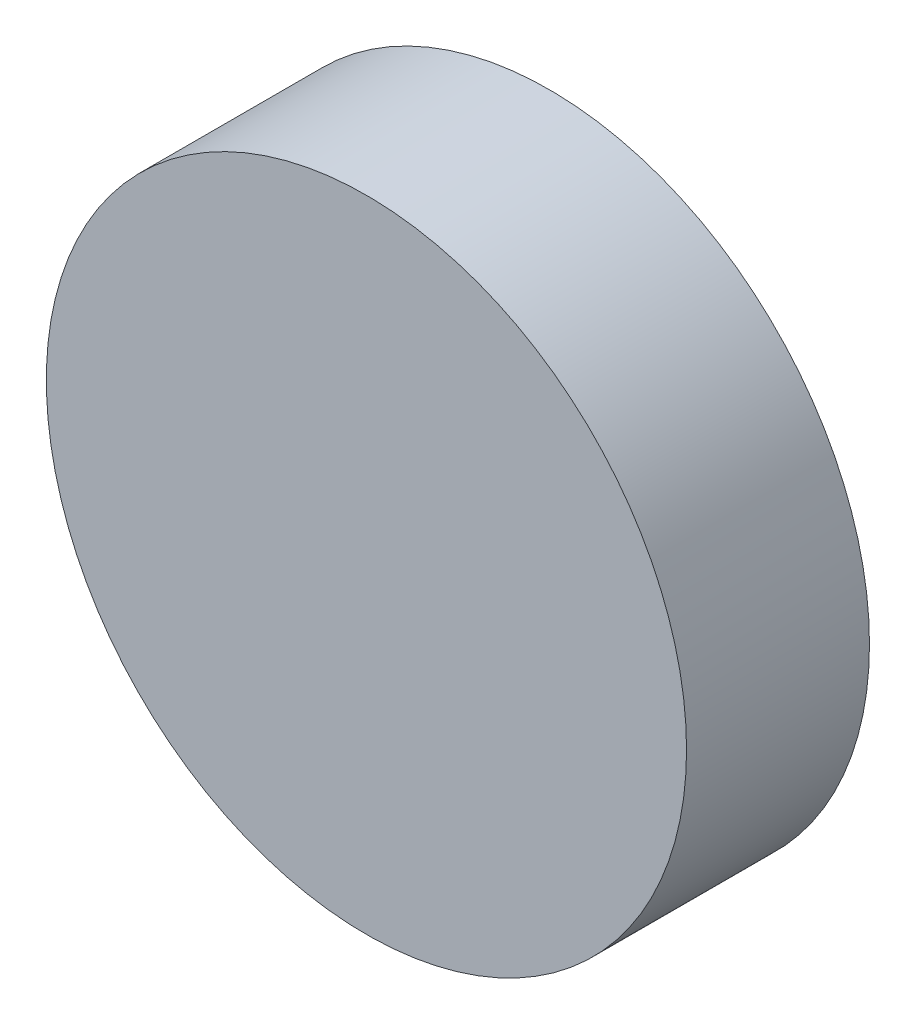
ISO-10303-21;
HEADER;
FILE_DESCRIPTION(('STEP AP214'),'2;1');
FILE_NAME('part.step','',(''),(''),'','','');
FILE_SCHEMA(('AUTOMOTIVE_DESIGN { 1 0 10303 214 1 1 1 1 }'));
ENDSEC;
DATA;
#1=APPLICATION_CONTEXT('core data for automotive mechanical design processes');
#2=APPLICATION_PROTOCOL_DEFINITION('international standard','automotive_design',2000,#1);
#3=PRODUCT_CONTEXT('',#1,'mechanical');
#4=PRODUCT('Part','Part','',(#3));
#5=PRODUCT_RELATED_PRODUCT_CATEGORY('part','',(#4));
#6=PRODUCT_DEFINITION_FORMATION('','',#4);
#7=PRODUCT_DEFINITION_CONTEXT('part definition',#1,'design');
#8=PRODUCT_DEFINITION('design','',#6,#7);
#9=PRODUCT_DEFINITION_SHAPE('','',#8);
#10=(LENGTH_UNIT() NAMED_UNIT(*) SI_UNIT(.MILLI.,.METRE.));
#11=(NAMED_UNIT(*) PLANE_ANGLE_UNIT() SI_UNIT($,.RADIAN.));
#12=(NAMED_UNIT(*) SI_UNIT($,.STERADIAN.) SOLID_ANGLE_UNIT());
#13=UNCERTAINTY_MEASURE_WITH_UNIT(LENGTH_MEASURE(1.E-05),#10,'distance_accuracy_value','');
#14=(GEOMETRIC_REPRESENTATION_CONTEXT(3) GLOBAL_UNCERTAINTY_ASSIGNED_CONTEXT((#13)) GLOBAL_UNIT_ASSIGNED_CONTEXT((#10,
#11,#12)) REPRESENTATION_CONTEXT('',''));
#15=CARTESIAN_POINT('',(0.,0.,0.));
#16=DIRECTION('',(0.,0.,1.));
#17=DIRECTION('',(1.,0.,0.));
#18=AXIS2_PLACEMENT_3D('',#15,#16,#17);
#19=CARTESIAN_POINT('',(0.,0.,10.));
#20=DIRECTION('',(0.,0.,-1.));
#21=DIRECTION('',(-1.,0.,0.));
#22=AXIS2_PLACEMENT_3D('',#19,#20,#21);
#23=CYLINDRICAL_SURFACE('',#22,17.5);
#24=CARTESIAN_POINT('',(0.,0.,10.));
#25=DIRECTION('',(0.,0.,1.));
#26=DIRECTION('',(1.,0.,0.));
#27=AXIS2_PLACEMENT_3D('',#24,#25,#26);
#28=CIRCLE('',#27,17.5);
#29=CARTESIAN_POINT('',(17.5,0.,10.));
#30=VERTEX_POINT('',#29);
#31=EDGE_CURVE('E10',#30,#30,#28,.T.);
#32=ORIENTED_EDGE('',*,*,#31,.F.);
#33=EDGE_LOOP('',(#32));
#34=FACE_BOUND('',#33,.T.);
#35=CARTESIAN_POINT('',(0.,0.,0.));
#36=DIRECTION('',(0.,0.,1.));
#37=DIRECTION('',(1.,0.,0.));
#38=AXIS2_PLACEMENT_3D('',#35,#36,#37);
#39=CIRCLE('',#38,17.5);
#40=CARTESIAN_POINT('',(17.5,0.,0.));
#41=VERTEX_POINT('',#40);
#42=EDGE_CURVE('E46',#41,#41,#39,.T.);
#43=ORIENTED_EDGE('',*,*,#42,.T.);
#44=EDGE_LOOP('',(#43));
#45=FACE_BOUND('',#44,.T.);
#46=ADVANCED_FACE('F43',(#34,#45),#23,.T.);
#47=CARTESIAN_POINT('',(0.,0.,10.));
#48=DIRECTION('',(0.,0.,1.));
#49=DIRECTION('',(1.,0.,0.));
#50=AXIS2_PLACEMENT_3D('',#47,#48,#49);
#51=PLANE('',#50);
#52=ORIENTED_EDGE('',*,*,#31,.T.);
#53=EDGE_LOOP('',(#52));
#54=FACE_BOUND('',#53,.T.);
#55=ADVANCED_FACE('F60',(#54),#51,.T.);
#56=CARTESIAN_POINT('',(0.,0.,0.));
#57=DIRECTION('',(0.,0.,1.));
#58=DIRECTION('',(1.,0.,0.));
#59=AXIS2_PLACEMENT_3D('',#56,#57,#58);
#60=PLANE('',#59);
#61=ORIENTED_EDGE('',*,*,#42,.F.);
#62=EDGE_LOOP('',(#61));
#63=FACE_BOUND('',#62,.T.);
#64=ADVANCED_FACE('F58',(#63),#60,.F.);
#65=CLOSED_SHELL('',(#46,#55,#64));
#66=MANIFOLD_SOLID_BREP('B2',#65);
#67=ADVANCED_BREP_SHAPE_REPRESENTATION('',(#18,#66),#14);
#68=SHAPE_DEFINITION_REPRESENTATION(#9,#67);
ENDSEC;
END-ISO-10303-21;
